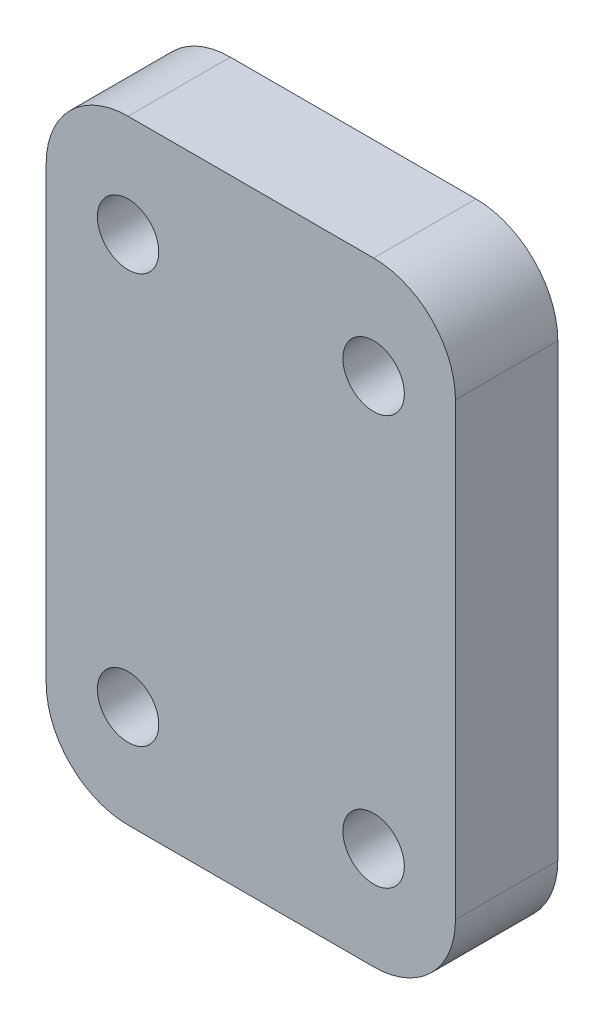
ISO-10303-21;
HEADER;
FILE_DESCRIPTION(('STEP AP214'),'2;1');
FILE_NAME('part.step','',(''),(''),'','','');
FILE_SCHEMA(('AUTOMOTIVE_DESIGN { 1 0 10303 214 1 1 1 1 }'));
ENDSEC;
DATA;
#1=APPLICATION_CONTEXT('core data for automotive mechanical design processes');
#2=APPLICATION_PROTOCOL_DEFINITION('international standard','automotive_design',2000,#1);
#3=PRODUCT_CONTEXT('',#1,'mechanical');
#4=PRODUCT('Part','Part','',(#3));
#5=PRODUCT_RELATED_PRODUCT_CATEGORY('part','',(#4));
#6=PRODUCT_DEFINITION_FORMATION('','',#4);
#7=PRODUCT_DEFINITION_CONTEXT('part definition',#1,'design');
#8=PRODUCT_DEFINITION('design','',#6,#7);
#9=PRODUCT_DEFINITION_SHAPE('','',#8);
#10=(LENGTH_UNIT() NAMED_UNIT(*) SI_UNIT(.MILLI.,.METRE.));
#11=(NAMED_UNIT(*) PLANE_ANGLE_UNIT() SI_UNIT($,.RADIAN.));
#12=(NAMED_UNIT(*) SI_UNIT($,.STERADIAN.) SOLID_ANGLE_UNIT());
#13=UNCERTAINTY_MEASURE_WITH_UNIT(LENGTH_MEASURE(1.E-05),#10,'distance_accuracy_value','');
#14=(GEOMETRIC_REPRESENTATION_CONTEXT(3) GLOBAL_UNCERTAINTY_ASSIGNED_CONTEXT((#13)) GLOBAL_UNIT_ASSIGNED_CONTEXT((#10,
#11,#12)) REPRESENTATION_CONTEXT('',''));
#15=CARTESIAN_POINT('',(0.,0.,0.));
#16=DIRECTION('',(0.,0.,1.));
#17=DIRECTION('',(1.,0.,0.));
#18=AXIS2_PLACEMENT_3D('',#15,#16,#17);
#19=CARTESIAN_POINT('',(6.,-11.,5.));
#20=DIRECTION('',(0.,0.,1.));
#21=DIRECTION('',(1.,0.,0.));
#22=AXIS2_PLACEMENT_3D('',#19,#20,#21);
#23=PLANE('',#22);
#24=CARTESIAN_POINT('',(-6.,-10.,5.));
#25=DIRECTION('',(0.,0.,1.));
#26=DIRECTION('',(1.,0.,0.));
#27=AXIS2_PLACEMENT_3D('',#24,#25,#26);
#28=CIRCLE('',#27,1.5);
#29=CARTESIAN_POINT('',(-4.5,-10.,5.));
#30=VERTEX_POINT('',#29);
#31=EDGE_CURVE('E188',#30,#30,#28,.T.);
#32=ORIENTED_EDGE('',*,*,#31,.F.);
#33=EDGE_LOOP('',(#32));
#34=FACE_BOUND('',#33,.T.);
#35=CARTESIAN_POINT('',(-6.,10.,5.));
#36=DIRECTION('',(0.,0.,1.));
#37=DIRECTION('',(1.,0.,0.));
#38=AXIS2_PLACEMENT_3D('',#35,#36,#37);
#39=CIRCLE('',#38,1.5);
#40=CARTESIAN_POINT('',(-4.5,10.,5.));
#41=VERTEX_POINT('',#40);
#42=EDGE_CURVE('E134',#41,#41,#39,.T.);
#43=ORIENTED_EDGE('',*,*,#42,.F.);
#44=EDGE_LOOP('',(#43));
#45=FACE_BOUND('',#44,.T.);
#46=CARTESIAN_POINT('',(6.,-11.,5.));
#47=DIRECTION('',(0.,0.,1.));
#48=DIRECTION('',(1.,0.,0.));
#49=AXIS2_PLACEMENT_3D('',#46,#47,#48);
#50=CIRCLE('',#49,4.);
#51=CARTESIAN_POINT('',(5.99999999999997,-15.,5.));
#52=VERTEX_POINT('',#51);
#53=CARTESIAN_POINT('',(10.,-11.,5.));
#54=VERTEX_POINT('',#53);
#55=EDGE_CURVE('E145',#52,#54,#50,.T.);
#56=ORIENTED_EDGE('',*,*,#55,.T.);
#57=DIRECTION('',(0.,1.,0.));
#58=VECTOR('',#57,1.);
#59=CARTESIAN_POINT('',(10.,11.,5.));
#60=LINE('',#59,#58);
#61=CARTESIAN_POINT('',(10.,11.,5.));
#62=VERTEX_POINT('',#61);
#63=EDGE_CURVE('E93',#54,#62,#60,.T.);
#64=ORIENTED_EDGE('',*,*,#63,.T.);
#65=CARTESIAN_POINT('',(6.,11.,5.));
#66=DIRECTION('',(0.,0.,1.));
#67=DIRECTION('',(-1.,0.,0.));
#68=AXIS2_PLACEMENT_3D('',#65,#66,#67);
#69=CIRCLE('',#68,4.);
#70=CARTESIAN_POINT('',(5.99999999999997,15.,5.));
#71=VERTEX_POINT('',#70);
#72=EDGE_CURVE('E160',#62,#71,#69,.T.);
#73=ORIENTED_EDGE('',*,*,#72,.T.);
#74=DIRECTION('',(-1.,0.,0.));
#75=VECTOR('',#74,1.);
#76=CARTESIAN_POINT('',(-5.99999999999997,15.,5.));
#77=LINE('',#76,#75);
#78=CARTESIAN_POINT('',(-5.99999999999997,15.,5.));
#79=VERTEX_POINT('',#78);
#80=EDGE_CURVE('E173',#71,#79,#77,.T.);
#81=ORIENTED_EDGE('',*,*,#80,.T.);
#82=CARTESIAN_POINT('',(-6.,11.,5.));
#83=DIRECTION('',(0.,0.,1.));
#84=DIRECTION('',(-1.,0.,0.));
#85=AXIS2_PLACEMENT_3D('',#82,#83,#84);
#86=CIRCLE('',#85,4.);
#87=CARTESIAN_POINT('',(-10.,11.,5.));
#88=VERTEX_POINT('',#87);
#89=EDGE_CURVE('E112',#79,#88,#86,.T.);
#90=ORIENTED_EDGE('',*,*,#89,.T.);
#91=DIRECTION('',(0.,-1.,0.));
#92=VECTOR('',#91,1.);
#93=CARTESIAN_POINT('',(-10.,11.,5.));
#94=LINE('',#93,#92);
#95=CARTESIAN_POINT('',(-10.,-11.,5.));
#96=VERTEX_POINT('',#95);
#97=EDGE_CURVE('E106',#88,#96,#94,.T.);
#98=ORIENTED_EDGE('',*,*,#97,.T.);
#99=CARTESIAN_POINT('',(-6.,-11.,5.));
#100=DIRECTION('',(0.,0.,1.));
#101=DIRECTION('',(1.,0.,0.));
#102=AXIS2_PLACEMENT_3D('',#99,#100,#101);
#103=CIRCLE('',#102,4.);
#104=CARTESIAN_POINT('',(-5.99999999999997,-15.,5.));
#105=VERTEX_POINT('',#104);
#106=EDGE_CURVE('E110',#96,#105,#103,.T.);
#107=ORIENTED_EDGE('',*,*,#106,.T.);
#108=DIRECTION('',(1.,0.,0.));
#109=VECTOR('',#108,1.);
#110=CARTESIAN_POINT('',(-5.99999999999997,-15.,5.));
#111=LINE('',#110,#109);
#112=EDGE_CURVE('E50',#105,#52,#111,.T.);
#113=ORIENTED_EDGE('',*,*,#112,.T.);
#114=EDGE_LOOP('',(#56,#64,#73,#81,#90,#98,#107,#113));
#115=FACE_BOUND('',#114,.T.);
#116=CARTESIAN_POINT('',(6.,10.,5.));
#117=DIRECTION('',(0.,0.,1.));
#118=DIRECTION('',(1.,0.,0.));
#119=AXIS2_PLACEMENT_3D('',#116,#117,#118);
#120=CIRCLE('',#119,1.5);
#121=CARTESIAN_POINT('',(7.5,10.,5.));
#122=VERTEX_POINT('',#121);
#123=EDGE_CURVE('E182',#122,#122,#120,.T.);
#124=ORIENTED_EDGE('',*,*,#123,.F.);
#125=EDGE_LOOP('',(#124));
#126=FACE_BOUND('',#125,.T.);
#127=CARTESIAN_POINT('',(6.,-10.,5.));
#128=DIRECTION('',(0.,0.,1.));
#129=DIRECTION('',(1.,0.,0.));
#130=AXIS2_PLACEMENT_3D('',#127,#128,#129);
#131=CIRCLE('',#130,1.5);
#132=CARTESIAN_POINT('',(7.5,-10.,5.));
#133=VERTEX_POINT('',#132);
#134=EDGE_CURVE('E194',#133,#133,#131,.T.);
#135=ORIENTED_EDGE('',*,*,#134,.F.);
#136=EDGE_LOOP('',(#135));
#137=FACE_BOUND('',#136,.T.);
#138=ADVANCED_FACE('F33',(#34,#45,#115,#126,#137),#23,.T.);
#139=CARTESIAN_POINT('',(6.,-11.,0.));
#140=DIRECTION('',(0.,0.,1.));
#141=DIRECTION('',(1.,0.,0.));
#142=AXIS2_PLACEMENT_3D('',#139,#140,#141);
#143=PLANE('',#142);
#144=CARTESIAN_POINT('',(6.,-11.,0.));
#145=DIRECTION('',(0.,0.,1.));
#146=DIRECTION('',(1.,0.,0.));
#147=AXIS2_PLACEMENT_3D('',#144,#145,#146);
#148=CIRCLE('',#147,4.);
#149=CARTESIAN_POINT('',(5.99999999999997,-15.,0.));
#150=VERTEX_POINT('',#149);
#151=CARTESIAN_POINT('',(10.,-11.,0.));
#152=VERTEX_POINT('',#151);
#153=EDGE_CURVE('E130',#150,#152,#148,.T.);
#154=ORIENTED_EDGE('',*,*,#153,.F.);
#155=DIRECTION('',(1.,0.,0.));
#156=VECTOR('',#155,1.);
#157=CARTESIAN_POINT('',(-5.99999999999997,-15.,0.));
#158=LINE('',#157,#156);
#159=CARTESIAN_POINT('',(-5.99999999999997,-15.,0.));
#160=VERTEX_POINT('',#159);
#161=EDGE_CURVE('E85',#160,#150,#158,.T.);
#162=ORIENTED_EDGE('',*,*,#161,.F.);
#163=CARTESIAN_POINT('',(-6.,-11.,0.));
#164=DIRECTION('',(0.,0.,1.));
#165=DIRECTION('',(1.,0.,0.));
#166=AXIS2_PLACEMENT_3D('',#163,#164,#165);
#167=CIRCLE('',#166,4.);
#168=CARTESIAN_POINT('',(-10.,-11.,0.));
#169=VERTEX_POINT('',#168);
#170=EDGE_CURVE('E79',#169,#160,#167,.T.);
#171=ORIENTED_EDGE('',*,*,#170,.F.);
#172=DIRECTION('',(0.,-1.,0.));
#173=VECTOR('',#172,1.);
#174=CARTESIAN_POINT('',(-10.,11.,0.));
#175=LINE('',#174,#173);
#176=CARTESIAN_POINT('',(-10.,11.,0.));
#177=VERTEX_POINT('',#176);
#178=EDGE_CURVE('E120',#177,#169,#175,.T.);
#179=ORIENTED_EDGE('',*,*,#178,.F.);
#180=CARTESIAN_POINT('',(-6.,11.,0.));
#181=DIRECTION('',(0.,0.,1.));
#182=DIRECTION('',(-1.,0.,0.));
#183=AXIS2_PLACEMENT_3D('',#180,#181,#182);
#184=CIRCLE('',#183,4.);
#185=CARTESIAN_POINT('',(-5.99999999999997,15.,0.));
#186=VERTEX_POINT('',#185);
#187=EDGE_CURVE('E140',#186,#177,#184,.T.);
#188=ORIENTED_EDGE('',*,*,#187,.F.);
#189=DIRECTION('',(-1.,0.,0.));
#190=VECTOR('',#189,1.);
#191=CARTESIAN_POINT('',(-5.99999999999997,15.,0.));
#192=LINE('',#191,#190);
#193=CARTESIAN_POINT('',(5.99999999999997,15.,0.));
#194=VERTEX_POINT('',#193);
#195=EDGE_CURVE('E138',#194,#186,#192,.T.);
#196=ORIENTED_EDGE('',*,*,#195,.F.);
#197=CARTESIAN_POINT('',(6.,11.,0.));
#198=DIRECTION('',(0.,0.,1.));
#199=DIRECTION('',(-1.,0.,0.));
#200=AXIS2_PLACEMENT_3D('',#197,#198,#199);
#201=CIRCLE('',#200,4.);
#202=CARTESIAN_POINT('',(10.,11.,0.));
#203=VERTEX_POINT('',#202);
#204=EDGE_CURVE('E136',#203,#194,#201,.T.);
#205=ORIENTED_EDGE('',*,*,#204,.F.);
#206=DIRECTION('',(0.,1.,0.));
#207=VECTOR('',#206,1.);
#208=CARTESIAN_POINT('',(10.,11.,0.));
#209=LINE('',#208,#207);
#210=EDGE_CURVE('E133',#152,#203,#209,.T.);
#211=ORIENTED_EDGE('',*,*,#210,.F.);
#212=EDGE_LOOP('',(#154,#162,#171,#179,#188,#196,#205,#211));
#213=FACE_BOUND('',#212,.T.);
#214=CARTESIAN_POINT('',(-6.,10.,0.));
#215=DIRECTION('',(0.,0.,1.));
#216=DIRECTION('',(1.,0.,0.));
#217=AXIS2_PLACEMENT_3D('',#214,#215,#216);
#218=CIRCLE('',#217,1.5);
#219=CARTESIAN_POINT('',(-4.5,10.,0.));
#220=VERTEX_POINT('',#219);
#221=EDGE_CURVE('E179',#220,#220,#218,.T.);
#222=ORIENTED_EDGE('',*,*,#221,.T.);
#223=EDGE_LOOP('',(#222));
#224=FACE_BOUND('',#223,.T.);
#225=CARTESIAN_POINT('',(6.,10.,0.));
#226=DIRECTION('',(0.,0.,1.));
#227=DIRECTION('',(1.,0.,0.));
#228=AXIS2_PLACEMENT_3D('',#225,#226,#227);
#229=CIRCLE('',#228,1.5);
#230=CARTESIAN_POINT('',(7.5,10.,0.));
#231=VERTEX_POINT('',#230);
#232=EDGE_CURVE('E185',#231,#231,#229,.T.);
#233=ORIENTED_EDGE('',*,*,#232,.T.);
#234=EDGE_LOOP('',(#233));
#235=FACE_BOUND('',#234,.T.);
#236=CARTESIAN_POINT('',(-6.,-10.,0.));
#237=DIRECTION('',(0.,0.,1.));
#238=DIRECTION('',(1.,0.,0.));
#239=AXIS2_PLACEMENT_3D('',#236,#237,#238);
#240=CIRCLE('',#239,1.5);
#241=CARTESIAN_POINT('',(-4.5,-10.,0.));
#242=VERTEX_POINT('',#241);
#243=EDGE_CURVE('E191',#242,#242,#240,.T.);
#244=ORIENTED_EDGE('',*,*,#243,.T.);
#245=EDGE_LOOP('',(#244));
#246=FACE_BOUND('',#245,.T.);
#247=CARTESIAN_POINT('',(6.,-10.,0.));
#248=DIRECTION('',(0.,0.,1.));
#249=DIRECTION('',(1.,0.,0.));
#250=AXIS2_PLACEMENT_3D('',#247,#248,#249);
#251=CIRCLE('',#250,1.5);
#252=CARTESIAN_POINT('',(7.5,-10.,0.));
#253=VERTEX_POINT('',#252);
#254=EDGE_CURVE('E197',#253,#253,#251,.T.);
#255=ORIENTED_EDGE('',*,*,#254,.T.);
#256=EDGE_LOOP('',(#255));
#257=FACE_BOUND('',#256,.T.);
#258=ADVANCED_FACE('F164',(#213,#224,#235,#246,#257),#143,.F.);
#259=CARTESIAN_POINT('',(6.,-11.,5.));
#260=DIRECTION('',(0.,0.,-1.));
#261=DIRECTION('',(-1.,0.,0.));
#262=AXIS2_PLACEMENT_3D('',#259,#260,#261);
#263=CYLINDRICAL_SURFACE('',#262,4.);
#264=ORIENTED_EDGE('',*,*,#153,.T.);
#265=DIRECTION('',(0.,0.,-1.));
#266=VECTOR('',#265,1.);
#267=CARTESIAN_POINT('',(10.,-11.,5.));
#268=LINE('',#267,#266);
#269=EDGE_CURVE('E11',#54,#152,#268,.T.);
#270=ORIENTED_EDGE('',*,*,#269,.F.);
#271=ORIENTED_EDGE('',*,*,#55,.F.);
#272=DIRECTION('',(0.,0.,-1.));
#273=VECTOR('',#272,1.);
#274=CARTESIAN_POINT('',(5.99999999999997,-15.,5.));
#275=LINE('',#274,#273);
#276=EDGE_CURVE('E126',#52,#150,#275,.T.);
#277=ORIENTED_EDGE('',*,*,#276,.T.);
#278=EDGE_LOOP('',(#264,#270,#271,#277));
#279=FACE_BOUND('',#278,.T.);
#280=ADVANCED_FACE('F35',(#279),#263,.T.);
#281=CARTESIAN_POINT('',(10.,11.,5.));
#282=DIRECTION('',(-1.,0.,0.));
#283=DIRECTION('',(0.,0.,1.));
#284=AXIS2_PLACEMENT_3D('',#281,#282,#283);
#285=PLANE('',#284);
#286=ORIENTED_EDGE('',*,*,#210,.T.);
#287=DIRECTION('',(0.,0.,-1.));
#288=VECTOR('',#287,1.);
#289=CARTESIAN_POINT('',(10.,11.,5.));
#290=LINE('',#289,#288);
#291=EDGE_CURVE('E42',#62,#203,#290,.T.);
#292=ORIENTED_EDGE('',*,*,#291,.F.);
#293=ORIENTED_EDGE('',*,*,#63,.F.);
#294=ORIENTED_EDGE('',*,*,#269,.T.);
#295=EDGE_LOOP('',(#286,#292,#293,#294));
#296=FACE_BOUND('',#295,.T.);
#297=ADVANCED_FACE('F231',(#296),#285,.F.);
#298=CARTESIAN_POINT('',(6.,11.,5.));
#299=DIRECTION('',(0.,0.,-1.));
#300=DIRECTION('',(-1.,0.,0.));
#301=AXIS2_PLACEMENT_3D('',#298,#299,#300);
#302=CYLINDRICAL_SURFACE('',#301,4.);
#303=ORIENTED_EDGE('',*,*,#204,.T.);
#304=DIRECTION('',(0.,0.,-1.));
#305=VECTOR('',#304,1.);
#306=CARTESIAN_POINT('',(5.99999999999997,15.,5.));
#307=LINE('',#306,#305);
#308=EDGE_CURVE('E152',#71,#194,#307,.T.);
#309=ORIENTED_EDGE('',*,*,#308,.F.);
#310=ORIENTED_EDGE('',*,*,#72,.F.);
#311=ORIENTED_EDGE('',*,*,#291,.T.);
#312=EDGE_LOOP('',(#303,#309,#310,#311));
#313=FACE_BOUND('',#312,.T.);
#314=ADVANCED_FACE('F158',(#313),#302,.T.);
#315=CARTESIAN_POINT('',(-5.99999999999997,15.,5.));
#316=DIRECTION('',(0.,-1.,0.));
#317=DIRECTION('',(0.,0.,-1.));
#318=AXIS2_PLACEMENT_3D('',#315,#316,#317);
#319=PLANE('',#318);
#320=ORIENTED_EDGE('',*,*,#195,.T.);
#321=DIRECTION('',(0.,0.,-1.));
#322=VECTOR('',#321,1.);
#323=CARTESIAN_POINT('',(-5.99999999999997,15.,5.));
#324=LINE('',#323,#322);
#325=EDGE_CURVE('E149',#79,#186,#324,.T.);
#326=ORIENTED_EDGE('',*,*,#325,.F.);
#327=ORIENTED_EDGE('',*,*,#80,.F.);
#328=ORIENTED_EDGE('',*,*,#308,.T.);
#329=EDGE_LOOP('',(#320,#326,#327,#328));
#330=FACE_BOUND('',#329,.T.);
#331=ADVANCED_FACE('F169',(#330),#319,.F.);
#332=CARTESIAN_POINT('',(-6.,11.,5.));
#333=DIRECTION('',(0.,0.,-1.));
#334=DIRECTION('',(-1.,0.,0.));
#335=AXIS2_PLACEMENT_3D('',#332,#333,#334);
#336=CYLINDRICAL_SURFACE('',#335,4.);
#337=ORIENTED_EDGE('',*,*,#187,.T.);
#338=DIRECTION('',(0.,0.,-1.));
#339=VECTOR('',#338,1.);
#340=CARTESIAN_POINT('',(-10.,11.,5.));
#341=LINE('',#340,#339);
#342=EDGE_CURVE('E121',#88,#177,#341,.T.);
#343=ORIENTED_EDGE('',*,*,#342,.F.);
#344=ORIENTED_EDGE('',*,*,#89,.F.);
#345=ORIENTED_EDGE('',*,*,#325,.T.);
#346=EDGE_LOOP('',(#337,#343,#344,#345));
#347=FACE_BOUND('',#346,.T.);
#348=ADVANCED_FACE('F172',(#347),#336,.T.);
#349=CARTESIAN_POINT('',(-10.,11.,5.));
#350=DIRECTION('',(1.,0.,0.));
#351=DIRECTION('',(0.,0.,-1.));
#352=AXIS2_PLACEMENT_3D('',#349,#350,#351);
#353=PLANE('',#352);
#354=ORIENTED_EDGE('',*,*,#178,.T.);
#355=DIRECTION('',(0.,0.,-1.));
#356=VECTOR('',#355,1.);
#357=CARTESIAN_POINT('',(-10.,-11.,5.));
#358=LINE('',#357,#356);
#359=EDGE_CURVE('E117',#96,#169,#358,.T.);
#360=ORIENTED_EDGE('',*,*,#359,.F.);
#361=ORIENTED_EDGE('',*,*,#97,.F.);
#362=ORIENTED_EDGE('',*,*,#342,.T.);
#363=EDGE_LOOP('',(#354,#360,#361,#362));
#364=FACE_BOUND('',#363,.T.);
#365=ADVANCED_FACE('F118',(#364),#353,.F.);
#366=CARTESIAN_POINT('',(-6.,-11.,5.));
#367=DIRECTION('',(0.,0.,-1.));
#368=DIRECTION('',(-1.,0.,0.));
#369=AXIS2_PLACEMENT_3D('',#366,#367,#368);
#370=CYLINDRICAL_SURFACE('',#369,4.);
#371=ORIENTED_EDGE('',*,*,#170,.T.);
#372=DIRECTION('',(0.,0.,-1.));
#373=VECTOR('',#372,1.);
#374=CARTESIAN_POINT('',(-5.99999999999997,-15.,5.));
#375=LINE('',#374,#373);
#376=EDGE_CURVE('E122',#105,#160,#375,.T.);
#377=ORIENTED_EDGE('',*,*,#376,.F.);
#378=ORIENTED_EDGE('',*,*,#106,.F.);
#379=ORIENTED_EDGE('',*,*,#359,.T.);
#380=EDGE_LOOP('',(#371,#377,#378,#379));
#381=FACE_BOUND('',#380,.T.);
#382=ADVANCED_FACE('F124',(#381),#370,.T.);
#383=CARTESIAN_POINT('',(-5.99999999999997,-15.,5.));
#384=DIRECTION('',(0.,1.,0.));
#385=DIRECTION('',(0.,0.,1.));
#386=AXIS2_PLACEMENT_3D('',#383,#384,#385);
#387=PLANE('',#386);
#388=ORIENTED_EDGE('',*,*,#161,.T.);
#389=ORIENTED_EDGE('',*,*,#276,.F.);
#390=ORIENTED_EDGE('',*,*,#112,.F.);
#391=ORIENTED_EDGE('',*,*,#376,.T.);
#392=EDGE_LOOP('',(#388,#389,#390,#391));
#393=FACE_BOUND('',#392,.T.);
#394=ADVANCED_FACE('F219',(#393),#387,.F.);
#395=CARTESIAN_POINT('',(-6.,10.,5.));
#396=DIRECTION('',(0.,0.,-1.));
#397=DIRECTION('',(-1.,0.,0.));
#398=AXIS2_PLACEMENT_3D('',#395,#396,#397);
#399=CYLINDRICAL_SURFACE('',#398,1.5);
#400=ORIENTED_EDGE('',*,*,#42,.T.);
#401=EDGE_LOOP('',(#400));
#402=FACE_BOUND('',#401,.T.);
#403=ORIENTED_EDGE('',*,*,#221,.F.);
#404=EDGE_LOOP('',(#403));
#405=FACE_BOUND('',#404,.T.);
#406=ADVANCED_FACE('F216',(#402,#405),#399,.F.);
#407=CARTESIAN_POINT('',(6.,10.,5.));
#408=DIRECTION('',(0.,0.,-1.));
#409=DIRECTION('',(-1.,0.,0.));
#410=AXIS2_PLACEMENT_3D('',#407,#408,#409);
#411=CYLINDRICAL_SURFACE('',#410,1.5);
#412=ORIENTED_EDGE('',*,*,#123,.T.);
#413=EDGE_LOOP('',(#412));
#414=FACE_BOUND('',#413,.T.);
#415=ORIENTED_EDGE('',*,*,#232,.F.);
#416=EDGE_LOOP('',(#415));
#417=FACE_BOUND('',#416,.T.);
#418=ADVANCED_FACE('F295',(#414,#417),#411,.F.);
#419=CARTESIAN_POINT('',(-6.,-10.,5.));
#420=DIRECTION('',(0.,0.,-1.));
#421=DIRECTION('',(-1.,0.,0.));
#422=AXIS2_PLACEMENT_3D('',#419,#420,#421);
#423=CYLINDRICAL_SURFACE('',#422,1.5);
#424=ORIENTED_EDGE('',*,*,#31,.T.);
#425=EDGE_LOOP('',(#424));
#426=FACE_BOUND('',#425,.T.);
#427=ORIENTED_EDGE('',*,*,#243,.F.);
#428=EDGE_LOOP('',(#427));
#429=FACE_BOUND('',#428,.T.);
#430=ADVANCED_FACE('F303',(#426,#429),#423,.F.);
#431=CARTESIAN_POINT('',(6.,-10.,5.));
#432=DIRECTION('',(0.,0.,-1.));
#433=DIRECTION('',(-1.,0.,0.));
#434=AXIS2_PLACEMENT_3D('',#431,#432,#433);
#435=CYLINDRICAL_SURFACE('',#434,1.5);
#436=ORIENTED_EDGE('',*,*,#134,.T.);
#437=EDGE_LOOP('',(#436));
#438=FACE_BOUND('',#437,.T.);
#439=ORIENTED_EDGE('',*,*,#254,.F.);
#440=EDGE_LOOP('',(#439));
#441=FACE_BOUND('',#440,.T.);
#442=ADVANCED_FACE('F203',(#438,#441),#435,.F.);
#443=CLOSED_SHELL('',(#138,#258,#280,#297,#314,#331,#348,#365,#382,#394,#406,#418,#430,#442));
#444=MANIFOLD_SOLID_BREP('B2',#443);
#445=ADVANCED_BREP_SHAPE_REPRESENTATION('',(#18,#444),#14);
#446=SHAPE_DEFINITION_REPRESENTATION(#9,#445);
ENDSEC;
END-ISO-10303-21;
